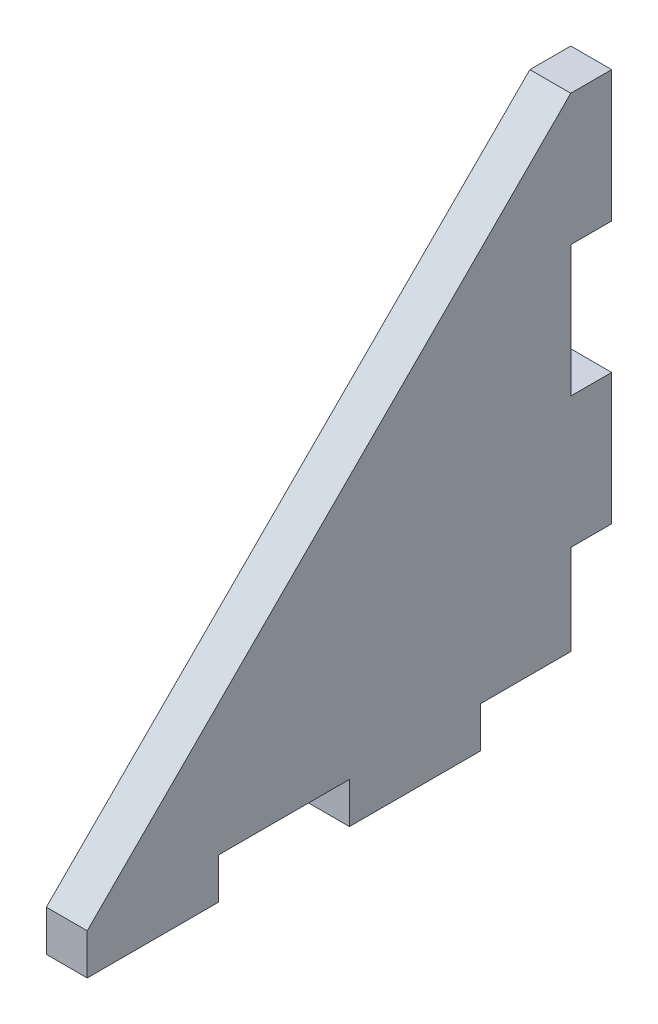
ISO-10303-21;
HEADER;
FILE_DESCRIPTION(('STEP AP214'),'2;1');
FILE_NAME('part.step','',(''),(''),'','','');
FILE_SCHEMA(('AUTOMOTIVE_DESIGN { 1 0 10303 214 1 1 1 1 }'));
ENDSEC;
DATA;
#1=APPLICATION_CONTEXT('core data for automotive mechanical design processes');
#2=APPLICATION_PROTOCOL_DEFINITION('international standard','automotive_design',2000,#1);
#3=PRODUCT_CONTEXT('',#1,'mechanical');
#4=PRODUCT('Part','Part','',(#3));
#5=PRODUCT_RELATED_PRODUCT_CATEGORY('part','',(#4));
#6=PRODUCT_DEFINITION_FORMATION('','',#4);
#7=PRODUCT_DEFINITION_CONTEXT('part definition',#1,'design');
#8=PRODUCT_DEFINITION('design','',#6,#7);
#9=PRODUCT_DEFINITION_SHAPE('','',#8);
#10=(LENGTH_UNIT() NAMED_UNIT(*) SI_UNIT(.MILLI.,.METRE.));
#11=(NAMED_UNIT(*) PLANE_ANGLE_UNIT() SI_UNIT($,.RADIAN.));
#12=(NAMED_UNIT(*) SI_UNIT($,.STERADIAN.) SOLID_ANGLE_UNIT());
#13=UNCERTAINTY_MEASURE_WITH_UNIT(LENGTH_MEASURE(1.E-05),#10,'distance_accuracy_value','');
#14=(GEOMETRIC_REPRESENTATION_CONTEXT(3) GLOBAL_UNCERTAINTY_ASSIGNED_CONTEXT((#13)) GLOBAL_UNIT_ASSIGNED_CONTEXT((#10,
#11,#12)) REPRESENTATION_CONTEXT('',''));
#15=CARTESIAN_POINT('',(0.,0.,0.));
#16=DIRECTION('',(0.,0.,1.));
#17=DIRECTION('',(1.,0.,0.));
#18=AXIS2_PLACEMENT_3D('',#15,#16,#17);
#19=CARTESIAN_POINT('',(3.12,3.12,40.));
#20=DIRECTION('',(0.,0.707106781186547,0.707106781186548));
#21=DIRECTION('',(0.,-0.707106781186548,0.707106781186547));
#22=AXIS2_PLACEMENT_3D('',#19,#20,#21);
#23=PLANE('',#22);
#24=DIRECTION('',(0.,0.707106781186547,-0.707106781186547));
#25=VECTOR('',#24,1.);
#26=CARTESIAN_POINT('',(0.,3.12,40.));
#27=LINE('',#26,#25);
#28=CARTESIAN_POINT('',(0.,3.12,40.));
#29=VERTEX_POINT('',#28);
#30=CARTESIAN_POINT('',(0.,40.,3.12));
#31=VERTEX_POINT('',#30);
#32=EDGE_CURVE('E183',#29,#31,#27,.T.);
#33=ORIENTED_EDGE('',*,*,#32,.F.);
#34=DIRECTION('',(-1.,0.,0.));
#35=VECTOR('',#34,1.);
#36=CARTESIAN_POINT('',(3.12,3.12,40.));
#37=LINE('',#36,#35);
#38=CARTESIAN_POINT('',(3.12,3.12,40.));
#39=VERTEX_POINT('',#38);
#40=EDGE_CURVE('E11',#39,#29,#37,.T.);
#41=ORIENTED_EDGE('',*,*,#40,.F.);
#42=DIRECTION('',(0.,0.707106781186547,-0.707106781186547));
#43=VECTOR('',#42,1.);
#44=CARTESIAN_POINT('',(3.12,3.12,40.));
#45=LINE('',#44,#43);
#46=CARTESIAN_POINT('',(3.12,40.,3.12));
#47=VERTEX_POINT('',#46);
#48=EDGE_CURVE('E230',#39,#47,#45,.T.);
#49=ORIENTED_EDGE('',*,*,#48,.T.);
#50=DIRECTION('',(-1.,0.,0.));
#51=VECTOR('',#50,1.);
#52=CARTESIAN_POINT('',(3.12,40.,3.12));
#53=LINE('',#52,#51);
#54=EDGE_CURVE('E35',#47,#31,#53,.T.);
#55=ORIENTED_EDGE('',*,*,#54,.T.);
#56=EDGE_LOOP('',(#33,#41,#49,#55));
#57=FACE_BOUND('',#56,.T.);
#58=ADVANCED_FACE('F32',(#57),#23,.T.);
#59=CARTESIAN_POINT('',(3.12,0.,40.));
#60=DIRECTION('',(0.,0.,1.));
#61=DIRECTION('',(1.,0.,0.));
#62=AXIS2_PLACEMENT_3D('',#59,#60,#61);
#63=PLANE('',#62);
#64=DIRECTION('',(0.,1.,0.));
#65=VECTOR('',#64,1.);
#66=CARTESIAN_POINT('',(0.,0.,40.));
#67=LINE('',#66,#65);
#68=CARTESIAN_POINT('',(0.,0.,40.));
#69=VERTEX_POINT('',#68);
#70=EDGE_CURVE('E228',#69,#29,#67,.T.);
#71=ORIENTED_EDGE('',*,*,#70,.F.);
#72=DIRECTION('',(-1.,0.,0.));
#73=VECTOR('',#72,1.);
#74=CARTESIAN_POINT('',(3.12,0.,40.));
#75=LINE('',#74,#73);
#76=CARTESIAN_POINT('',(3.12,0.,40.));
#77=VERTEX_POINT('',#76);
#78=EDGE_CURVE('E41',#77,#69,#75,.T.);
#79=ORIENTED_EDGE('',*,*,#78,.F.);
#80=DIRECTION('',(0.,1.,0.));
#81=VECTOR('',#80,1.);
#82=CARTESIAN_POINT('',(3.12,0.,40.));
#83=LINE('',#82,#81);
#84=EDGE_CURVE('E173',#77,#39,#83,.T.);
#85=ORIENTED_EDGE('',*,*,#84,.T.);
#86=ORIENTED_EDGE('',*,*,#40,.T.);
#87=EDGE_LOOP('',(#71,#79,#85,#86));
#88=FACE_BOUND('',#87,.T.);
#89=ADVANCED_FACE('F260',(#88),#63,.T.);
#90=CARTESIAN_POINT('',(3.12,0.,30.));
#91=DIRECTION('',(0.,-1.,0.));
#92=DIRECTION('',(0.,0.,-1.));
#93=AXIS2_PLACEMENT_3D('',#90,#91,#92);
#94=PLANE('',#93);
#95=DIRECTION('',(0.,0.,1.));
#96=VECTOR('',#95,1.);
#97=CARTESIAN_POINT('',(0.,0.,30.));
#98=LINE('',#97,#96);
#99=CARTESIAN_POINT('',(0.,0.,30.));
#100=VERTEX_POINT('',#99);
#101=EDGE_CURVE('E160',#100,#69,#98,.T.);
#102=ORIENTED_EDGE('',*,*,#101,.F.);
#103=DIRECTION('',(-1.,0.,0.));
#104=VECTOR('',#103,1.);
#105=CARTESIAN_POINT('',(3.12,0.,30.));
#106=LINE('',#105,#104);
#107=CARTESIAN_POINT('',(3.12,0.,30.));
#108=VERTEX_POINT('',#107);
#109=EDGE_CURVE('E155',#108,#100,#106,.T.);
#110=ORIENTED_EDGE('',*,*,#109,.F.);
#111=DIRECTION('',(0.,0.,1.));
#112=VECTOR('',#111,1.);
#113=CARTESIAN_POINT('',(3.12,0.,30.));
#114=LINE('',#113,#112);
#115=EDGE_CURVE('E158',#108,#77,#114,.T.);
#116=ORIENTED_EDGE('',*,*,#115,.T.);
#117=ORIENTED_EDGE('',*,*,#78,.T.);
#118=EDGE_LOOP('',(#102,#110,#116,#117));
#119=FACE_BOUND('',#118,.T.);
#120=ADVANCED_FACE('F157',(#119),#94,.T.);
#121=CARTESIAN_POINT('',(3.12,3.12,30.));
#122=DIRECTION('',(0.,0.,-1.));
#123=DIRECTION('',(-1.,0.,0.));
#124=AXIS2_PLACEMENT_3D('',#121,#122,#123);
#125=PLANE('',#124);
#126=DIRECTION('',(0.,-1.,0.));
#127=VECTOR('',#126,1.);
#128=CARTESIAN_POINT('',(0.,3.12,30.));
#129=LINE('',#128,#127);
#130=CARTESIAN_POINT('',(0.,3.12,30.));
#131=VERTEX_POINT('',#130);
#132=EDGE_CURVE('E225',#131,#100,#129,.T.);
#133=ORIENTED_EDGE('',*,*,#132,.F.);
#134=DIRECTION('',(-1.,0.,0.));
#135=VECTOR('',#134,1.);
#136=CARTESIAN_POINT('',(3.12,3.12,30.));
#137=LINE('',#136,#135);
#138=CARTESIAN_POINT('',(3.12,3.12,30.));
#139=VERTEX_POINT('',#138);
#140=EDGE_CURVE('E165',#139,#131,#137,.T.);
#141=ORIENTED_EDGE('',*,*,#140,.F.);
#142=DIRECTION('',(0.,-1.,0.));
#143=VECTOR('',#142,1.);
#144=CARTESIAN_POINT('',(3.12,3.12,30.));
#145=LINE('',#144,#143);
#146=EDGE_CURVE('E171',#139,#108,#145,.T.);
#147=ORIENTED_EDGE('',*,*,#146,.T.);
#148=ORIENTED_EDGE('',*,*,#109,.T.);
#149=EDGE_LOOP('',(#133,#141,#147,#148));
#150=FACE_BOUND('',#149,.T.);
#151=ADVANCED_FACE('F175',(#150),#125,.T.);
#152=CARTESIAN_POINT('',(3.12,3.12,20.));
#153=DIRECTION('',(0.,-1.,0.));
#154=DIRECTION('',(0.,0.,-1.));
#155=AXIS2_PLACEMENT_3D('',#152,#153,#154);
#156=PLANE('',#155);
#157=DIRECTION('',(0.,0.,1.));
#158=VECTOR('',#157,1.);
#159=CARTESIAN_POINT('',(0.,3.12,20.));
#160=LINE('',#159,#158);
#161=CARTESIAN_POINT('',(0.,3.12,20.));
#162=VERTEX_POINT('',#161);
#163=EDGE_CURVE('E222',#162,#131,#160,.T.);
#164=ORIENTED_EDGE('',*,*,#163,.F.);
#165=DIRECTION('',(-1.,0.,0.));
#166=VECTOR('',#165,1.);
#167=CARTESIAN_POINT('',(3.12,3.12,20.));
#168=LINE('',#167,#166);
#169=CARTESIAN_POINT('',(3.12,3.12,20.));
#170=VERTEX_POINT('',#169);
#171=EDGE_CURVE('E234',#170,#162,#168,.T.);
#172=ORIENTED_EDGE('',*,*,#171,.F.);
#173=DIRECTION('',(0.,0.,1.));
#174=VECTOR('',#173,1.);
#175=CARTESIAN_POINT('',(3.12,3.12,20.));
#176=LINE('',#175,#174);
#177=EDGE_CURVE('E176',#170,#139,#176,.T.);
#178=ORIENTED_EDGE('',*,*,#177,.T.);
#179=ORIENTED_EDGE('',*,*,#140,.T.);
#180=EDGE_LOOP('',(#164,#172,#178,#179));
#181=FACE_BOUND('',#180,.T.);
#182=ADVANCED_FACE('F273',(#181),#156,.T.);
#183=CARTESIAN_POINT('',(3.12,0.,20.));
#184=DIRECTION('',(0.,0.,1.));
#185=DIRECTION('',(1.,0.,0.));
#186=AXIS2_PLACEMENT_3D('',#183,#184,#185);
#187=PLANE('',#186);
#188=DIRECTION('',(0.,1.,0.));
#189=VECTOR('',#188,1.);
#190=CARTESIAN_POINT('',(0.,0.,20.));
#191=LINE('',#190,#189);
#192=CARTESIAN_POINT('',(0.,0.,20.));
#193=VERTEX_POINT('',#192);
#194=EDGE_CURVE('E219',#193,#162,#191,.T.);
#195=ORIENTED_EDGE('',*,*,#194,.F.);
#196=DIRECTION('',(-1.,0.,0.));
#197=VECTOR('',#196,1.);
#198=CARTESIAN_POINT('',(3.12,0.,20.));
#199=LINE('',#198,#197);
#200=CARTESIAN_POINT('',(3.12,0.,20.));
#201=VERTEX_POINT('',#200);
#202=EDGE_CURVE('E236',#201,#193,#199,.T.);
#203=ORIENTED_EDGE('',*,*,#202,.F.);
#204=DIRECTION('',(0.,1.,0.));
#205=VECTOR('',#204,1.);
#206=CARTESIAN_POINT('',(3.12,0.,20.));
#207=LINE('',#206,#205);
#208=EDGE_CURVE('E178',#201,#170,#207,.T.);
#209=ORIENTED_EDGE('',*,*,#208,.T.);
#210=ORIENTED_EDGE('',*,*,#171,.T.);
#211=EDGE_LOOP('',(#195,#203,#209,#210));
#212=FACE_BOUND('',#211,.T.);
#213=ADVANCED_FACE('F276',(#212),#187,.T.);
#214=CARTESIAN_POINT('',(3.12,0.,10.));
#215=DIRECTION('',(0.,-1.,0.));
#216=DIRECTION('',(0.,0.,-1.));
#217=AXIS2_PLACEMENT_3D('',#214,#215,#216);
#218=PLANE('',#217);
#219=DIRECTION('',(0.,0.,1.));
#220=VECTOR('',#219,1.);
#221=CARTESIAN_POINT('',(0.,0.,10.));
#222=LINE('',#221,#220);
#223=CARTESIAN_POINT('',(0.,0.,10.));
#224=VERTEX_POINT('',#223);
#225=EDGE_CURVE('E216',#224,#193,#222,.T.);
#226=ORIENTED_EDGE('',*,*,#225,.F.);
#227=DIRECTION('',(-1.,0.,0.));
#228=VECTOR('',#227,1.);
#229=CARTESIAN_POINT('',(3.12,0.,10.));
#230=LINE('',#229,#228);
#231=CARTESIAN_POINT('',(3.12,0.,10.));
#232=VERTEX_POINT('',#231);
#233=EDGE_CURVE('E238',#232,#224,#230,.T.);
#234=ORIENTED_EDGE('',*,*,#233,.F.);
#235=DIRECTION('',(0.,0.,1.));
#236=VECTOR('',#235,1.);
#237=CARTESIAN_POINT('',(3.12,0.,10.));
#238=LINE('',#237,#236);
#239=EDGE_CURVE('E474',#232,#201,#238,.T.);
#240=ORIENTED_EDGE('',*,*,#239,.T.);
#241=ORIENTED_EDGE('',*,*,#202,.T.);
#242=EDGE_LOOP('',(#226,#234,#240,#241));
#243=FACE_BOUND('',#242,.T.);
#244=ADVANCED_FACE('F280',(#243),#218,.T.);
#245=CARTESIAN_POINT('',(3.12,3.12,10.));
#246=DIRECTION('',(0.,0.,-1.));
#247=DIRECTION('',(-1.,0.,0.));
#248=AXIS2_PLACEMENT_3D('',#245,#246,#247);
#249=PLANE('',#248);
#250=DIRECTION('',(0.,-1.,0.));
#251=VECTOR('',#250,1.);
#252=CARTESIAN_POINT('',(0.,3.12,10.));
#253=LINE('',#252,#251);
#254=CARTESIAN_POINT('',(0.,3.12,10.));
#255=VERTEX_POINT('',#254);
#256=EDGE_CURVE('E213',#255,#224,#253,.T.);
#257=ORIENTED_EDGE('',*,*,#256,.F.);
#258=DIRECTION('',(-1.,0.,0.));
#259=VECTOR('',#258,1.);
#260=CARTESIAN_POINT('',(3.12,3.12,10.));
#261=LINE('',#260,#259);
#262=CARTESIAN_POINT('',(3.12,3.12,10.));
#263=VERTEX_POINT('',#262);
#264=EDGE_CURVE('E240',#263,#255,#261,.T.);
#265=ORIENTED_EDGE('',*,*,#264,.F.);
#266=DIRECTION('',(0.,-1.,0.));
#267=VECTOR('',#266,1.);
#268=CARTESIAN_POINT('',(3.12,3.12,10.));
#269=LINE('',#268,#267);
#270=EDGE_CURVE('E467',#263,#232,#269,.T.);
#271=ORIENTED_EDGE('',*,*,#270,.T.);
#272=ORIENTED_EDGE('',*,*,#233,.T.);
#273=EDGE_LOOP('',(#257,#265,#271,#272));
#274=FACE_BOUND('',#273,.T.);
#275=ADVANCED_FACE('F284',(#274),#249,.T.);
#276=CARTESIAN_POINT('',(3.12,3.12,3.12));
#277=DIRECTION('',(0.,-1.,0.));
#278=DIRECTION('',(0.,0.,-1.));
#279=AXIS2_PLACEMENT_3D('',#276,#277,#278);
#280=PLANE('',#279);
#281=DIRECTION('',(0.,0.,1.));
#282=VECTOR('',#281,1.);
#283=CARTESIAN_POINT('',(0.,3.12,3.12));
#284=LINE('',#283,#282);
#285=CARTESIAN_POINT('',(0.,3.12,3.12));
#286=VERTEX_POINT('',#285);
#287=EDGE_CURVE('E210',#286,#255,#284,.T.);
#288=ORIENTED_EDGE('',*,*,#287,.F.);
#289=DIRECTION('',(-1.,0.,0.));
#290=VECTOR('',#289,1.);
#291=CARTESIAN_POINT('',(3.12,3.12,3.12));
#292=LINE('',#291,#290);
#293=CARTESIAN_POINT('',(3.12,3.12,3.12));
#294=VERTEX_POINT('',#293);
#295=EDGE_CURVE('E242',#294,#286,#292,.T.);
#296=ORIENTED_EDGE('',*,*,#295,.F.);
#297=DIRECTION('',(0.,0.,1.));
#298=VECTOR('',#297,1.);
#299=CARTESIAN_POINT('',(3.12,3.12,3.12));
#300=LINE('',#299,#298);
#301=EDGE_CURVE('E463',#294,#263,#300,.T.);
#302=ORIENTED_EDGE('',*,*,#301,.T.);
#303=ORIENTED_EDGE('',*,*,#264,.T.);
#304=EDGE_LOOP('',(#288,#296,#302,#303));
#305=FACE_BOUND('',#304,.T.);
#306=ADVANCED_FACE('F288',(#305),#280,.T.);
#307=CARTESIAN_POINT('',(3.12,9.99999999999999,3.12));
#308=DIRECTION('',(0.,0.,-1.));
#309=DIRECTION('',(-1.,0.,0.));
#310=AXIS2_PLACEMENT_3D('',#307,#308,#309);
#311=PLANE('',#310);
#312=DIRECTION('',(0.,-1.,0.));
#313=VECTOR('',#312,1.);
#314=CARTESIAN_POINT('',(0.,9.99999999999999,3.12));
#315=LINE('',#314,#313);
#316=CARTESIAN_POINT('',(0.,9.99999999999999,3.12));
#317=VERTEX_POINT('',#316);
#318=EDGE_CURVE('E207',#317,#286,#315,.T.);
#319=ORIENTED_EDGE('',*,*,#318,.F.);
#320=DIRECTION('',(-1.,0.,0.));
#321=VECTOR('',#320,1.);
#322=CARTESIAN_POINT('',(3.12,9.99999999999999,3.12));
#323=LINE('',#322,#321);
#324=CARTESIAN_POINT('',(3.12,9.99999999999999,3.12));
#325=VERTEX_POINT('',#324);
#326=EDGE_CURVE('E244',#325,#317,#323,.T.);
#327=ORIENTED_EDGE('',*,*,#326,.F.);
#328=DIRECTION('',(0.,-1.,0.));
#329=VECTOR('',#328,1.);
#330=CARTESIAN_POINT('',(3.12,9.99999999999999,3.12));
#331=LINE('',#330,#329);
#332=EDGE_CURVE('E479',#325,#294,#331,.T.);
#333=ORIENTED_EDGE('',*,*,#332,.T.);
#334=ORIENTED_EDGE('',*,*,#295,.T.);
#335=EDGE_LOOP('',(#319,#327,#333,#334));
#336=FACE_BOUND('',#335,.T.);
#337=ADVANCED_FACE('F292',(#336),#311,.T.);
#338=CARTESIAN_POINT('',(3.12,9.99999999999999,0.));
#339=DIRECTION('',(0.,-1.,0.));
#340=DIRECTION('',(0.,0.,-1.));
#341=AXIS2_PLACEMENT_3D('',#338,#339,#340);
#342=PLANE('',#341);
#343=DIRECTION('',(0.,0.,1.));
#344=VECTOR('',#343,1.);
#345=CARTESIAN_POINT('',(0.,9.99999999999999,0.));
#346=LINE('',#345,#344);
#347=CARTESIAN_POINT('',(0.,9.99999999999999,0.));
#348=VERTEX_POINT('',#347);
#349=EDGE_CURVE('E204',#348,#317,#346,.T.);
#350=ORIENTED_EDGE('',*,*,#349,.F.);
#351=DIRECTION('',(-1.,0.,0.));
#352=VECTOR('',#351,1.);
#353=CARTESIAN_POINT('',(3.12,9.99999999999999,0.));
#354=LINE('',#353,#352);
#355=CARTESIAN_POINT('',(3.12,9.99999999999999,0.));
#356=VERTEX_POINT('',#355);
#357=EDGE_CURVE('E246',#356,#348,#354,.T.);
#358=ORIENTED_EDGE('',*,*,#357,.F.);
#359=DIRECTION('',(0.,0.,1.));
#360=VECTOR('',#359,1.);
#361=CARTESIAN_POINT('',(3.12,9.99999999999999,0.));
#362=LINE('',#361,#360);
#363=EDGE_CURVE('E456',#356,#325,#362,.T.);
#364=ORIENTED_EDGE('',*,*,#363,.T.);
#365=ORIENTED_EDGE('',*,*,#326,.T.);
#366=EDGE_LOOP('',(#350,#358,#364,#365));
#367=FACE_BOUND('',#366,.T.);
#368=ADVANCED_FACE('F296',(#367),#342,.T.);
#369=CARTESIAN_POINT('',(3.12,20.,0.));
#370=DIRECTION('',(0.,0.,-1.));
#371=DIRECTION('',(-1.,0.,0.));
#372=AXIS2_PLACEMENT_3D('',#369,#370,#371);
#373=PLANE('',#372);
#374=DIRECTION('',(0.,-1.,0.));
#375=VECTOR('',#374,1.);
#376=CARTESIAN_POINT('',(0.,20.,0.));
#377=LINE('',#376,#375);
#378=CARTESIAN_POINT('',(0.,20.,0.));
#379=VERTEX_POINT('',#378);
#380=EDGE_CURVE('E201',#379,#348,#377,.T.);
#381=ORIENTED_EDGE('',*,*,#380,.F.);
#382=DIRECTION('',(-1.,0.,0.));
#383=VECTOR('',#382,1.);
#384=CARTESIAN_POINT('',(3.12,20.,0.));
#385=LINE('',#384,#383);
#386=CARTESIAN_POINT('',(3.12,20.,0.));
#387=VERTEX_POINT('',#386);
#388=EDGE_CURVE('E248',#387,#379,#385,.T.);
#389=ORIENTED_EDGE('',*,*,#388,.F.);
#390=DIRECTION('',(0.,-1.,0.));
#391=VECTOR('',#390,1.);
#392=CARTESIAN_POINT('',(3.12,20.,0.));
#393=LINE('',#392,#391);
#394=EDGE_CURVE('E452',#387,#356,#393,.T.);
#395=ORIENTED_EDGE('',*,*,#394,.T.);
#396=ORIENTED_EDGE('',*,*,#357,.T.);
#397=EDGE_LOOP('',(#381,#389,#395,#396));
#398=FACE_BOUND('',#397,.T.);
#399=ADVANCED_FACE('F300',(#398),#373,.T.);
#400=CARTESIAN_POINT('',(3.12,20.,3.12));
#401=DIRECTION('',(0.,1.,0.));
#402=DIRECTION('',(0.,0.,1.));
#403=AXIS2_PLACEMENT_3D('',#400,#401,#402);
#404=PLANE('',#403);
#405=DIRECTION('',(0.,0.,-1.));
#406=VECTOR('',#405,1.);
#407=CARTESIAN_POINT('',(0.,20.,3.12));
#408=LINE('',#407,#406);
#409=CARTESIAN_POINT('',(0.,20.,3.12));
#410=VERTEX_POINT('',#409);
#411=EDGE_CURVE('E198',#410,#379,#408,.T.);
#412=ORIENTED_EDGE('',*,*,#411,.F.);
#413=DIRECTION('',(-1.,0.,0.));
#414=VECTOR('',#413,1.);
#415=CARTESIAN_POINT('',(3.12,20.,3.12));
#416=LINE('',#415,#414);
#417=CARTESIAN_POINT('',(3.12,20.,3.12));
#418=VERTEX_POINT('',#417);
#419=EDGE_CURVE('E250',#418,#410,#416,.T.);
#420=ORIENTED_EDGE('',*,*,#419,.F.);
#421=DIRECTION('',(0.,0.,-1.));
#422=VECTOR('',#421,1.);
#423=CARTESIAN_POINT('',(3.12,20.,3.12));
#424=LINE('',#423,#422);
#425=EDGE_CURVE('E483',#418,#387,#424,.T.);
#426=ORIENTED_EDGE('',*,*,#425,.T.);
#427=ORIENTED_EDGE('',*,*,#388,.T.);
#428=EDGE_LOOP('',(#412,#420,#426,#427));
#429=FACE_BOUND('',#428,.T.);
#430=ADVANCED_FACE('F304',(#429),#404,.T.);
#431=CARTESIAN_POINT('',(3.12,30.,3.12));
#432=DIRECTION('',(0.,0.,-1.));
#433=DIRECTION('',(-1.,0.,0.));
#434=AXIS2_PLACEMENT_3D('',#431,#432,#433);
#435=PLANE('',#434);
#436=DIRECTION('',(0.,-1.,0.));
#437=VECTOR('',#436,1.);
#438=CARTESIAN_POINT('',(0.,30.,3.12));
#439=LINE('',#438,#437);
#440=CARTESIAN_POINT('',(0.,30.,3.12));
#441=VERTEX_POINT('',#440);
#442=EDGE_CURVE('E195',#441,#410,#439,.T.);
#443=ORIENTED_EDGE('',*,*,#442,.F.);
#444=DIRECTION('',(-1.,0.,0.));
#445=VECTOR('',#444,1.);
#446=CARTESIAN_POINT('',(3.12,30.,3.12));
#447=LINE('',#446,#445);
#448=CARTESIAN_POINT('',(3.12,30.,3.12));
#449=VERTEX_POINT('',#448);
#450=EDGE_CURVE('E252',#449,#441,#447,.T.);
#451=ORIENTED_EDGE('',*,*,#450,.F.);
#452=DIRECTION('',(0.,-1.,0.));
#453=VECTOR('',#452,1.);
#454=CARTESIAN_POINT('',(3.12,30.,3.12));
#455=LINE('',#454,#453);
#456=EDGE_CURVE('E445',#449,#418,#455,.T.);
#457=ORIENTED_EDGE('',*,*,#456,.T.);
#458=ORIENTED_EDGE('',*,*,#419,.T.);
#459=EDGE_LOOP('',(#443,#451,#457,#458));
#460=FACE_BOUND('',#459,.T.);
#461=ADVANCED_FACE('F308',(#460),#435,.T.);
#462=CARTESIAN_POINT('',(3.12,30.,0.));
#463=DIRECTION('',(0.,-1.,0.));
#464=DIRECTION('',(0.,0.,-1.));
#465=AXIS2_PLACEMENT_3D('',#462,#463,#464);
#466=PLANE('',#465);
#467=DIRECTION('',(0.,0.,1.));
#468=VECTOR('',#467,1.);
#469=CARTESIAN_POINT('',(0.,30.,0.));
#470=LINE('',#469,#468);
#471=CARTESIAN_POINT('',(0.,30.,0.));
#472=VERTEX_POINT('',#471);
#473=EDGE_CURVE('E192',#472,#441,#470,.T.);
#474=ORIENTED_EDGE('',*,*,#473,.F.);
#475=DIRECTION('',(-1.,0.,0.));
#476=VECTOR('',#475,1.);
#477=CARTESIAN_POINT('',(3.12,30.,0.));
#478=LINE('',#477,#476);
#479=CARTESIAN_POINT('',(3.12,30.,0.));
#480=VERTEX_POINT('',#479);
#481=EDGE_CURVE('E254',#480,#472,#478,.T.);
#482=ORIENTED_EDGE('',*,*,#481,.F.);
#483=DIRECTION('',(0.,0.,1.));
#484=VECTOR('',#483,1.);
#485=CARTESIAN_POINT('',(3.12,30.,0.));
#486=LINE('',#485,#484);
#487=EDGE_CURVE('E441',#480,#449,#486,.T.);
#488=ORIENTED_EDGE('',*,*,#487,.T.);
#489=ORIENTED_EDGE('',*,*,#450,.T.);
#490=EDGE_LOOP('',(#474,#482,#488,#489));
#491=FACE_BOUND('',#490,.T.);
#492=ADVANCED_FACE('F312',(#491),#466,.T.);
#493=CARTESIAN_POINT('',(3.12,40.,0.));
#494=DIRECTION('',(0.,0.,-1.));
#495=DIRECTION('',(-1.,0.,0.));
#496=AXIS2_PLACEMENT_3D('',#493,#494,#495);
#497=PLANE('',#496);
#498=DIRECTION('',(0.,-1.,0.));
#499=VECTOR('',#498,1.);
#500=CARTESIAN_POINT('',(0.,40.,0.));
#501=LINE('',#500,#499);
#502=CARTESIAN_POINT('',(0.,40.,0.));
#503=VERTEX_POINT('',#502);
#504=EDGE_CURVE('E189',#503,#472,#501,.T.);
#505=ORIENTED_EDGE('',*,*,#504,.F.);
#506=DIRECTION('',(-1.,0.,0.));
#507=VECTOR('',#506,1.);
#508=CARTESIAN_POINT('',(3.12,40.,0.));
#509=LINE('',#508,#507);
#510=CARTESIAN_POINT('',(3.12,40.,0.));
#511=VERTEX_POINT('',#510);
#512=EDGE_CURVE('E255',#511,#503,#509,.T.);
#513=ORIENTED_EDGE('',*,*,#512,.F.);
#514=DIRECTION('',(0.,-1.,0.));
#515=VECTOR('',#514,1.);
#516=CARTESIAN_POINT('',(3.12,40.,0.));
#517=LINE('',#516,#515);
#518=EDGE_CURVE('E487',#511,#480,#517,.T.);
#519=ORIENTED_EDGE('',*,*,#518,.T.);
#520=ORIENTED_EDGE('',*,*,#481,.T.);
#521=EDGE_LOOP('',(#505,#513,#519,#520));
#522=FACE_BOUND('',#521,.T.);
#523=ADVANCED_FACE('F316',(#522),#497,.T.);
#524=CARTESIAN_POINT('',(3.12,40.,3.12));
#525=DIRECTION('',(0.,1.,0.));
#526=DIRECTION('',(0.,0.,1.));
#527=AXIS2_PLACEMENT_3D('',#524,#525,#526);
#528=PLANE('',#527);
#529=DIRECTION('',(0.,0.,-1.));
#530=VECTOR('',#529,1.);
#531=CARTESIAN_POINT('',(0.,40.,3.12));
#532=LINE('',#531,#530);
#533=EDGE_CURVE('E186',#31,#503,#532,.T.);
#534=ORIENTED_EDGE('',*,*,#533,.F.);
#535=ORIENTED_EDGE('',*,*,#54,.F.);
#536=DIRECTION('',(0.,0.,-1.));
#537=VECTOR('',#536,1.);
#538=CARTESIAN_POINT('',(3.12,40.,3.12));
#539=LINE('',#538,#537);
#540=EDGE_CURVE('E489',#47,#511,#539,.T.);
#541=ORIENTED_EDGE('',*,*,#540,.T.);
#542=ORIENTED_EDGE('',*,*,#512,.T.);
#543=EDGE_LOOP('',(#534,#535,#541,#542));
#544=FACE_BOUND('',#543,.T.);
#545=ADVANCED_FACE('F257',(#544),#528,.T.);
#546=CARTESIAN_POINT('',(3.12,0.,0.));
#547=DIRECTION('',(-1.,0.,0.));
#548=DIRECTION('',(0.,0.,1.));
#549=AXIS2_PLACEMENT_3D('',#546,#547,#548);
#550=PLANE('',#549);
#551=ORIENTED_EDGE('',*,*,#48,.F.);
#552=ORIENTED_EDGE('',*,*,#84,.F.);
#553=ORIENTED_EDGE('',*,*,#115,.F.);
#554=ORIENTED_EDGE('',*,*,#146,.F.);
#555=ORIENTED_EDGE('',*,*,#177,.F.);
#556=ORIENTED_EDGE('',*,*,#208,.F.);
#557=ORIENTED_EDGE('',*,*,#239,.F.);
#558=ORIENTED_EDGE('',*,*,#270,.F.);
#559=ORIENTED_EDGE('',*,*,#301,.F.);
#560=ORIENTED_EDGE('',*,*,#332,.F.);
#561=ORIENTED_EDGE('',*,*,#363,.F.);
#562=ORIENTED_EDGE('',*,*,#394,.F.);
#563=ORIENTED_EDGE('',*,*,#425,.F.);
#564=ORIENTED_EDGE('',*,*,#456,.F.);
#565=ORIENTED_EDGE('',*,*,#487,.F.);
#566=ORIENTED_EDGE('',*,*,#518,.F.);
#567=ORIENTED_EDGE('',*,*,#540,.F.);
#568=EDGE_LOOP('',(#551,#552,#553,#554,#555,#556,#557,#558,#559,#560,#561,#562,#563,#564,#565,
#566,#567));
#569=FACE_BOUND('',#568,.T.);
#570=ADVANCED_FACE('F169',(#569),#550,.F.);
#571=CARTESIAN_POINT('',(0.,0.,0.));
#572=DIRECTION('',(-1.,0.,0.));
#573=DIRECTION('',(0.,0.,1.));
#574=AXIS2_PLACEMENT_3D('',#571,#572,#573);
#575=PLANE('',#574);
#576=ORIENTED_EDGE('',*,*,#32,.T.);
#577=ORIENTED_EDGE('',*,*,#533,.T.);
#578=ORIENTED_EDGE('',*,*,#504,.T.);
#579=ORIENTED_EDGE('',*,*,#473,.T.);
#580=ORIENTED_EDGE('',*,*,#442,.T.);
#581=ORIENTED_EDGE('',*,*,#411,.T.);
#582=ORIENTED_EDGE('',*,*,#380,.T.);
#583=ORIENTED_EDGE('',*,*,#349,.T.);
#584=ORIENTED_EDGE('',*,*,#318,.T.);
#585=ORIENTED_EDGE('',*,*,#287,.T.);
#586=ORIENTED_EDGE('',*,*,#256,.T.);
#587=ORIENTED_EDGE('',*,*,#225,.T.);
#588=ORIENTED_EDGE('',*,*,#194,.T.);
#589=ORIENTED_EDGE('',*,*,#163,.T.);
#590=ORIENTED_EDGE('',*,*,#132,.T.);
#591=ORIENTED_EDGE('',*,*,#101,.T.);
#592=ORIENTED_EDGE('',*,*,#70,.T.);
#593=EDGE_LOOP('',(#576,#577,#578,#579,#580,#581,#582,#583,#584,#585,#586,#587,#588,#589,#590,
#591,#592));
#594=FACE_BOUND('',#593,.T.);
#595=ADVANCED_FACE('F259',(#594),#575,.T.);
#596=CLOSED_SHELL('',(#58,#89,#120,#151,#182,#213,#244,#275,#306,#337,#368,#399,#430,#461,#492,
#523,#545,#570,#595));
#597=MANIFOLD_SOLID_BREP('B2',#596);
#598=ADVANCED_BREP_SHAPE_REPRESENTATION('',(#18,#597),#14);
#599=SHAPE_DEFINITION_REPRESENTATION(#9,#598);
ENDSEC;
END-ISO-10303-21;
